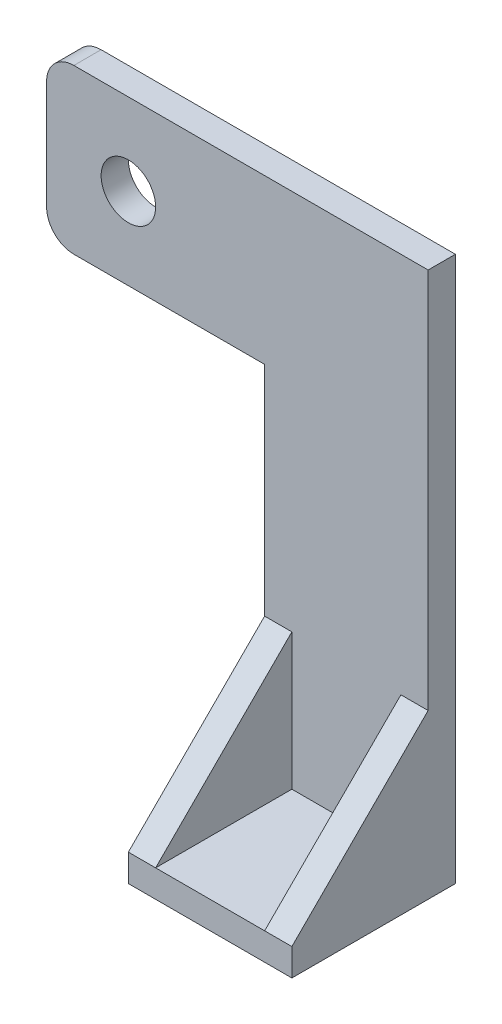
ISO-10303-21;
HEADER;
FILE_DESCRIPTION(('STEP AP214'),'2;1');
FILE_NAME('part.step','',(''),(''),'','','');
FILE_SCHEMA(('AUTOMOTIVE_DESIGN { 1 0 10303 214 1 1 1 1 }'));
ENDSEC;
DATA;
#1=APPLICATION_CONTEXT('core data for automotive mechanical design processes');
#2=APPLICATION_PROTOCOL_DEFINITION('international standard','automotive_design',2000,#1);
#3=PRODUCT_CONTEXT('',#1,'mechanical');
#4=PRODUCT('Part','Part','',(#3));
#5=PRODUCT_RELATED_PRODUCT_CATEGORY('part','',(#4));
#6=PRODUCT_DEFINITION_FORMATION('','',#4);
#7=PRODUCT_DEFINITION_CONTEXT('part definition',#1,'design');
#8=PRODUCT_DEFINITION('design','',#6,#7);
#9=PRODUCT_DEFINITION_SHAPE('','',#8);
#10=(LENGTH_UNIT() NAMED_UNIT(*) SI_UNIT(.MILLI.,.METRE.));
#11=(NAMED_UNIT(*) PLANE_ANGLE_UNIT() SI_UNIT($,.RADIAN.));
#12=(NAMED_UNIT(*) SI_UNIT($,.STERADIAN.) SOLID_ANGLE_UNIT());
#13=UNCERTAINTY_MEASURE_WITH_UNIT(LENGTH_MEASURE(1.E-05),#10,'distance_accuracy_value','');
#14=(GEOMETRIC_REPRESENTATION_CONTEXT(3) GLOBAL_UNCERTAINTY_ASSIGNED_CONTEXT((#13)) GLOBAL_UNIT_ASSIGNED_CONTEXT((#10,
#11,#12)) REPRESENTATION_CONTEXT('',''));
#15=CARTESIAN_POINT('',(0.,0.,0.));
#16=DIRECTION('',(0.,0.,1.));
#17=DIRECTION('',(1.,0.,0.));
#18=AXIS2_PLACEMENT_3D('',#15,#16,#17);
#19=CARTESIAN_POINT('',(0.,-95.,0.));
#20=DIRECTION('',(0.,1.,0.));
#21=DIRECTION('',(0.,0.,1.));
#22=AXIS2_PLACEMENT_3D('',#19,#20,#21);
#23=PLANE('',#22);
#24=DIRECTION('',(-1.,0.,0.));
#25=VECTOR('',#24,1.);
#26=CARTESIAN_POINT('',(40.,-95.,30.));
#27=LINE('',#26,#25);
#28=CARTESIAN_POINT('',(65.,-95.,30.));
#29=VERTEX_POINT('',#28);
#30=CARTESIAN_POINT('',(45.,-95.,30.));
#31=VERTEX_POINT('',#30);
#32=EDGE_CURVE('E238',#29,#31,#27,.T.);
#33=ORIENTED_EDGE('',*,*,#32,.F.);
#34=DIRECTION('',(0.,0.,1.));
#35=VECTOR('',#34,1.);
#36=CARTESIAN_POINT('',(65.,-95.,30.));
#37=LINE('',#36,#35);
#38=CARTESIAN_POINT('',(65.,-95.,5.));
#39=VERTEX_POINT('',#38);
#40=EDGE_CURVE('E251',#39,#29,#37,.T.);
#41=ORIENTED_EDGE('',*,*,#40,.F.);
#42=DIRECTION('',(-1.,0.,0.));
#43=VECTOR('',#42,1.);
#44=CARTESIAN_POINT('',(70.,-95.,5.));
#45=LINE('',#44,#43);
#46=CARTESIAN_POINT('',(45.,-95.,5.));
#47=VERTEX_POINT('',#46);
#48=EDGE_CURVE('E135',#39,#47,#45,.T.);
#49=ORIENTED_EDGE('',*,*,#48,.T.);
#50=DIRECTION('',(0.,0.,1.));
#51=VECTOR('',#50,1.);
#52=CARTESIAN_POINT('',(45.,-95.,30.));
#53=LINE('',#52,#51);
#54=EDGE_CURVE('E244',#47,#31,#53,.T.);
#55=ORIENTED_EDGE('',*,*,#54,.T.);
#56=EDGE_LOOP('',(#33,#41,#49,#55));
#57=FACE_BOUND('',#56,.T.);
#58=ADVANCED_FACE('F36',(#57),#23,.T.);
#59=CARTESIAN_POINT('',(5.,-5.,5.));
#60=DIRECTION('',(0.,0.,1.));
#61=DIRECTION('',(1.,0.,0.));
#62=AXIS2_PLACEMENT_3D('',#59,#60,#61);
#63=PLANE('',#62);
#64=CARTESIAN_POINT('',(15.,-15.,5.));
#65=DIRECTION('',(0.,0.,1.));
#66=DIRECTION('',(1.,0.,0.));
#67=AXIS2_PLACEMENT_3D('',#64,#65,#66);
#68=CIRCLE('',#67,5.);
#69=CARTESIAN_POINT('',(20.,-15.,5.));
#70=VERTEX_POINT('',#69);
#71=EDGE_CURVE('E214',#70,#70,#68,.T.);
#72=ORIENTED_EDGE('',*,*,#71,.F.);
#73=EDGE_LOOP('',(#72));
#74=FACE_BOUND('',#73,.T.);
#75=DIRECTION('',(0.,-1.,0.));
#76=VECTOR('',#75,1.);
#77=CARTESIAN_POINT('',(65.,-95.,5.));
#78=LINE('',#77,#76);
#79=CARTESIAN_POINT('',(65.,-70.,5.));
#80=VERTEX_POINT('',#79);
#81=EDGE_CURVE('E255',#80,#39,#78,.T.);
#82=ORIENTED_EDGE('',*,*,#81,.F.);
#83=DIRECTION('',(1.,0.,0.));
#84=VECTOR('',#83,1.);
#85=CARTESIAN_POINT('',(65.,-70.,5.));
#86=LINE('',#85,#84);
#87=CARTESIAN_POINT('',(70.,-70.,5.));
#88=VERTEX_POINT('',#87);
#89=EDGE_CURVE('E241',#80,#88,#86,.T.);
#90=ORIENTED_EDGE('',*,*,#89,.T.);
#91=DIRECTION('',(0.,-1.,0.));
#92=VECTOR('',#91,1.);
#93=CARTESIAN_POINT('',(70.,-30.,5.));
#94=LINE('',#93,#92);
#95=CARTESIAN_POINT('',(70.,0.,5.));
#96=VERTEX_POINT('',#95);
#97=EDGE_CURVE('E138',#96,#88,#94,.T.);
#98=ORIENTED_EDGE('',*,*,#97,.F.);
#99=DIRECTION('',(1.,0.,0.));
#100=VECTOR('',#99,1.);
#101=CARTESIAN_POINT('',(5.,0.,5.));
#102=LINE('',#101,#100);
#103=CARTESIAN_POINT('',(5.,0.,5.));
#104=VERTEX_POINT('',#103);
#105=EDGE_CURVE('E144',#104,#96,#102,.T.);
#106=ORIENTED_EDGE('',*,*,#105,.F.);
#107=CARTESIAN_POINT('',(5.,-5.,5.));
#108=DIRECTION('',(0.,0.,1.));
#109=DIRECTION('',(1.,0.,0.));
#110=AXIS2_PLACEMENT_3D('',#107,#108,#109);
#111=CIRCLE('',#110,5.);
#112=CARTESIAN_POINT('',(0.,-5.,5.));
#113=VERTEX_POINT('',#112);
#114=EDGE_CURVE('E163',#104,#113,#111,.T.);
#115=ORIENTED_EDGE('',*,*,#114,.T.);
#116=DIRECTION('',(0.,-1.,0.));
#117=VECTOR('',#116,1.);
#118=CARTESIAN_POINT('',(0.,-5.,5.));
#119=LINE('',#118,#117);
#120=CARTESIAN_POINT('',(0.,-25.,5.));
#121=VERTEX_POINT('',#120);
#122=EDGE_CURVE('E94',#113,#121,#119,.T.);
#123=ORIENTED_EDGE('',*,*,#122,.T.);
#124=CARTESIAN_POINT('',(5.,-25.,5.));
#125=DIRECTION('',(0.,0.,-1.));
#126=DIRECTION('',(-1.,0.,0.));
#127=AXIS2_PLACEMENT_3D('',#124,#125,#126);
#128=CIRCLE('',#127,5.);
#129=CARTESIAN_POINT('',(5.,-30.,5.));
#130=VERTEX_POINT('',#129);
#131=EDGE_CURVE('E116',#130,#121,#128,.T.);
#132=ORIENTED_EDGE('',*,*,#131,.F.);
#133=DIRECTION('',(1.,0.,0.));
#134=VECTOR('',#133,1.);
#135=CARTESIAN_POINT('',(5.,-30.,5.));
#136=LINE('',#135,#134);
#137=CARTESIAN_POINT('',(40.,-30.,5.));
#138=VERTEX_POINT('',#137);
#139=EDGE_CURVE('E107',#130,#138,#136,.T.);
#140=ORIENTED_EDGE('',*,*,#139,.T.);
#141=DIRECTION('',(0.,-1.,0.));
#142=VECTOR('',#141,1.);
#143=CARTESIAN_POINT('',(40.,-30.,5.));
#144=LINE('',#143,#142);
#145=CARTESIAN_POINT('',(40.,-70.,5.));
#146=VERTEX_POINT('',#145);
#147=EDGE_CURVE('E114',#138,#146,#144,.T.);
#148=ORIENTED_EDGE('',*,*,#147,.T.);
#149=DIRECTION('',(-1.,0.,0.));
#150=VECTOR('',#149,1.);
#151=CARTESIAN_POINT('',(45.,-70.,5.));
#152=LINE('',#151,#150);
#153=CARTESIAN_POINT('',(45.,-70.,5.));
#154=VERTEX_POINT('',#153);
#155=EDGE_CURVE('E234',#154,#146,#152,.T.);
#156=ORIENTED_EDGE('',*,*,#155,.F.);
#157=DIRECTION('',(0.,-1.,0.));
#158=VECTOR('',#157,1.);
#159=CARTESIAN_POINT('',(45.,-95.,5.));
#160=LINE('',#159,#158);
#161=EDGE_CURVE('E240',#154,#47,#160,.T.);
#162=ORIENTED_EDGE('',*,*,#161,.T.);
#163=ORIENTED_EDGE('',*,*,#48,.F.);
#164=EDGE_LOOP('',(#82,#90,#98,#106,#115,#123,#132,#140,#148,#156,#162,#163));
#165=FACE_BOUND('',#164,.T.);
#166=ADVANCED_FACE('F110',(#74,#165),#63,.T.);
#167=CARTESIAN_POINT('',(5.,-5.,5.));
#168=DIRECTION('',(0.,0.,-1.));
#169=DIRECTION('',(-1.,0.,0.));
#170=AXIS2_PLACEMENT_3D('',#167,#168,#169);
#171=CYLINDRICAL_SURFACE('',#170,5.);
#172=CARTESIAN_POINT('',(5.,-5.,0.));
#173=DIRECTION('',(0.,0.,1.));
#174=DIRECTION('',(1.,0.,0.));
#175=AXIS2_PLACEMENT_3D('',#172,#173,#174);
#176=CIRCLE('',#175,5.);
#177=CARTESIAN_POINT('',(5.,0.,0.));
#178=VERTEX_POINT('',#177);
#179=CARTESIAN_POINT('',(0.,-5.,0.));
#180=VERTEX_POINT('',#179);
#181=EDGE_CURVE('E146',#178,#180,#176,.T.);
#182=ORIENTED_EDGE('',*,*,#181,.T.);
#183=DIRECTION('',(0.,0.,-1.));
#184=VECTOR('',#183,1.);
#185=CARTESIAN_POINT('',(0.,-5.,5.));
#186=LINE('',#185,#184);
#187=EDGE_CURVE('E11',#113,#180,#186,.T.);
#188=ORIENTED_EDGE('',*,*,#187,.F.);
#189=ORIENTED_EDGE('',*,*,#114,.F.);
#190=DIRECTION('',(0.,0.,-1.));
#191=VECTOR('',#190,1.);
#192=CARTESIAN_POINT('',(5.,0.,5.));
#193=LINE('',#192,#191);
#194=EDGE_CURVE('E61',#104,#178,#193,.T.);
#195=ORIENTED_EDGE('',*,*,#194,.T.);
#196=EDGE_LOOP('',(#182,#188,#189,#195));
#197=FACE_BOUND('',#196,.T.);
#198=ADVANCED_FACE('F38',(#197),#171,.T.);
#199=CARTESIAN_POINT('',(0.,-5.,5.));
#200=DIRECTION('',(1.,0.,0.));
#201=DIRECTION('',(0.,0.,-1.));
#202=AXIS2_PLACEMENT_3D('',#199,#200,#201);
#203=PLANE('',#202);
#204=DIRECTION('',(0.,-1.,0.));
#205=VECTOR('',#204,1.);
#206=CARTESIAN_POINT('',(0.,-5.,0.));
#207=LINE('',#206,#205);
#208=CARTESIAN_POINT('',(0.,-25.,0.));
#209=VERTEX_POINT('',#208);
#210=EDGE_CURVE('E148',#180,#209,#207,.T.);
#211=ORIENTED_EDGE('',*,*,#210,.T.);
#212=DIRECTION('',(0.,0.,-1.));
#213=VECTOR('',#212,1.);
#214=CARTESIAN_POINT('',(0.,-25.,5.));
#215=LINE('',#214,#213);
#216=EDGE_CURVE('E45',#121,#209,#215,.T.);
#217=ORIENTED_EDGE('',*,*,#216,.F.);
#218=ORIENTED_EDGE('',*,*,#122,.F.);
#219=ORIENTED_EDGE('',*,*,#187,.T.);
#220=EDGE_LOOP('',(#211,#217,#218,#219));
#221=FACE_BOUND('',#220,.T.);
#222=ADVANCED_FACE('F170',(#221),#203,.F.);
#223=CARTESIAN_POINT('',(5.,-25.,5.));
#224=DIRECTION('',(0.,0.,-1.));
#225=DIRECTION('',(-1.,0.,0.));
#226=AXIS2_PLACEMENT_3D('',#223,#224,#225);
#227=CYLINDRICAL_SURFACE('',#226,5.);
#228=CARTESIAN_POINT('',(5.,-25.,0.));
#229=DIRECTION('',(0.,0.,-1.));
#230=DIRECTION('',(-1.,0.,0.));
#231=AXIS2_PLACEMENT_3D('',#228,#229,#230);
#232=CIRCLE('',#231,5.);
#233=CARTESIAN_POINT('',(5.,-30.,0.));
#234=VERTEX_POINT('',#233);
#235=EDGE_CURVE('E151',#234,#209,#232,.T.);
#236=ORIENTED_EDGE('',*,*,#235,.F.);
#237=DIRECTION('',(0.,0.,-1.));
#238=VECTOR('',#237,1.);
#239=CARTESIAN_POINT('',(5.,-30.,5.));
#240=LINE('',#239,#238);
#241=EDGE_CURVE('E127',#130,#234,#240,.T.);
#242=ORIENTED_EDGE('',*,*,#241,.F.);
#243=ORIENTED_EDGE('',*,*,#131,.T.);
#244=ORIENTED_EDGE('',*,*,#216,.T.);
#245=EDGE_LOOP('',(#236,#242,#243,#244));
#246=FACE_BOUND('',#245,.T.);
#247=ADVANCED_FACE('F169',(#246),#227,.T.);
#248=CARTESIAN_POINT('',(5.,-30.,5.));
#249=DIRECTION('',(0.,1.,0.));
#250=DIRECTION('',(0.,0.,1.));
#251=AXIS2_PLACEMENT_3D('',#248,#249,#250);
#252=PLANE('',#251);
#253=DIRECTION('',(1.,0.,0.));
#254=VECTOR('',#253,1.);
#255=CARTESIAN_POINT('',(5.,-30.,0.));
#256=LINE('',#255,#254);
#257=CARTESIAN_POINT('',(40.,-30.,0.));
#258=VERTEX_POINT('',#257);
#259=EDGE_CURVE('E123',#234,#258,#256,.T.);
#260=ORIENTED_EDGE('',*,*,#259,.T.);
#261=DIRECTION('',(0.,0.,-1.));
#262=VECTOR('',#261,1.);
#263=CARTESIAN_POINT('',(40.,-30.,5.));
#264=LINE('',#263,#262);
#265=EDGE_CURVE('E120',#138,#258,#264,.T.);
#266=ORIENTED_EDGE('',*,*,#265,.F.);
#267=ORIENTED_EDGE('',*,*,#139,.F.);
#268=ORIENTED_EDGE('',*,*,#241,.T.);
#269=EDGE_LOOP('',(#260,#266,#267,#268));
#270=FACE_BOUND('',#269,.T.);
#271=ADVANCED_FACE('F121',(#270),#252,.F.);
#272=CARTESIAN_POINT('',(40.,-30.,5.));
#273=DIRECTION('',(1.,0.,0.));
#274=DIRECTION('',(0.,1.,0.));
#275=AXIS2_PLACEMENT_3D('',#272,#273,#274);
#276=PLANE('',#275);
#277=DIRECTION('',(0.,-1.,0.));
#278=VECTOR('',#277,1.);
#279=CARTESIAN_POINT('',(40.,-30.,0.));
#280=LINE('',#279,#278);
#281=CARTESIAN_POINT('',(40.,-100.,0.));
#282=VERTEX_POINT('',#281);
#283=EDGE_CURVE('E155',#258,#282,#280,.T.);
#284=ORIENTED_EDGE('',*,*,#283,.T.);
#285=DIRECTION('',(0.,0.,-1.));
#286=VECTOR('',#285,1.);
#287=CARTESIAN_POINT('',(40.,-100.,0.));
#288=LINE('',#287,#286);
#289=CARTESIAN_POINT('',(40.,-100.,30.));
#290=VERTEX_POINT('',#289);
#291=EDGE_CURVE('E180',#290,#282,#288,.T.);
#292=ORIENTED_EDGE('',*,*,#291,.F.);
#293=DIRECTION('',(0.,1.,0.));
#294=VECTOR('',#293,1.);
#295=CARTESIAN_POINT('',(40.,-100.,30.));
#296=LINE('',#295,#294);
#297=CARTESIAN_POINT('',(40.,-95.,30.));
#298=VERTEX_POINT('',#297);
#299=EDGE_CURVE('E203',#290,#298,#296,.T.);
#300=ORIENTED_EDGE('',*,*,#299,.T.);
#301=DIRECTION('',(0.,0.707106781186547,-0.707106781186548));
#302=VECTOR('',#301,1.);
#303=CARTESIAN_POINT('',(40.,-70.,5.));
#304=LINE('',#303,#302);
#305=EDGE_CURVE('E134',#298,#146,#304,.T.);
#306=ORIENTED_EDGE('',*,*,#305,.T.);
#307=ORIENTED_EDGE('',*,*,#147,.F.);
#308=ORIENTED_EDGE('',*,*,#265,.T.);
#309=EDGE_LOOP('',(#284,#292,#300,#306,#307,#308));
#310=FACE_BOUND('',#309,.T.);
#311=ADVANCED_FACE('F131',(#310),#276,.F.);
#312=CARTESIAN_POINT('',(70.,0.,5.));
#313=DIRECTION('',(1.,0.,0.));
#314=DIRECTION('',(0.,0.,-1.));
#315=AXIS2_PLACEMENT_3D('',#312,#313,#314);
#316=PLANE('',#315);
#317=DIRECTION('',(0.,0.707106781186547,-0.707106781186548));
#318=VECTOR('',#317,1.);
#319=CARTESIAN_POINT('',(70.,-70.,5.));
#320=LINE('',#319,#318);
#321=CARTESIAN_POINT('',(70.,-95.,30.));
#322=VERTEX_POINT('',#321);
#323=EDGE_CURVE('E252',#322,#88,#320,.T.);
#324=ORIENTED_EDGE('',*,*,#323,.F.);
#325=DIRECTION('',(0.,1.,0.));
#326=VECTOR('',#325,1.);
#327=CARTESIAN_POINT('',(70.,-100.,30.));
#328=LINE('',#327,#326);
#329=CARTESIAN_POINT('',(70.,-100.,30.));
#330=VERTEX_POINT('',#329);
#331=EDGE_CURVE('E212',#330,#322,#328,.T.);
#332=ORIENTED_EDGE('',*,*,#331,.F.);
#333=DIRECTION('',(0.,0.,1.));
#334=VECTOR('',#333,1.);
#335=CARTESIAN_POINT('',(70.,-100.,0.));
#336=LINE('',#335,#334);
#337=CARTESIAN_POINT('',(70.,-100.,0.));
#338=VERTEX_POINT('',#337);
#339=EDGE_CURVE('E195',#338,#330,#336,.T.);
#340=ORIENTED_EDGE('',*,*,#339,.F.);
#341=DIRECTION('',(0.,-1.,0.));
#342=VECTOR('',#341,1.);
#343=CARTESIAN_POINT('',(70.,0.,0.));
#344=LINE('',#343,#342);
#345=CARTESIAN_POINT('',(70.,0.,0.));
#346=VERTEX_POINT('',#345);
#347=EDGE_CURVE('E157',#346,#338,#344,.T.);
#348=ORIENTED_EDGE('',*,*,#347,.F.);
#349=DIRECTION('',(0.,0.,-1.));
#350=VECTOR('',#349,1.);
#351=CARTESIAN_POINT('',(70.,0.,5.));
#352=LINE('',#351,#350);
#353=EDGE_CURVE('E128',#96,#346,#352,.T.);
#354=ORIENTED_EDGE('',*,*,#353,.F.);
#355=ORIENTED_EDGE('',*,*,#97,.T.);
#356=EDGE_LOOP('',(#324,#332,#340,#348,#354,#355));
#357=FACE_BOUND('',#356,.T.);
#358=ADVANCED_FACE('F228',(#357),#316,.T.);
#359=CARTESIAN_POINT('',(5.,0.,5.));
#360=DIRECTION('',(0.,1.,0.));
#361=DIRECTION('',(0.,0.,1.));
#362=AXIS2_PLACEMENT_3D('',#359,#360,#361);
#363=PLANE('',#362);
#364=DIRECTION('',(1.,0.,0.));
#365=VECTOR('',#364,1.);
#366=CARTESIAN_POINT('',(5.,0.,0.));
#367=LINE('',#366,#365);
#368=EDGE_CURVE('E160',#178,#346,#367,.T.);
#369=ORIENTED_EDGE('',*,*,#368,.F.);
#370=ORIENTED_EDGE('',*,*,#194,.F.);
#371=ORIENTED_EDGE('',*,*,#105,.T.);
#372=ORIENTED_EDGE('',*,*,#353,.T.);
#373=EDGE_LOOP('',(#369,#370,#371,#372));
#374=FACE_BOUND('',#373,.T.);
#375=ADVANCED_FACE('F223',(#374),#363,.T.);
#376=CARTESIAN_POINT('',(5.,-5.,0.));
#377=DIRECTION('',(0.,0.,1.));
#378=DIRECTION('',(1.,0.,0.));
#379=AXIS2_PLACEMENT_3D('',#376,#377,#378);
#380=PLANE('',#379);
#381=CARTESIAN_POINT('',(15.,-15.,0.));
#382=DIRECTION('',(0.,0.,1.));
#383=DIRECTION('',(1.,0.,0.));
#384=AXIS2_PLACEMENT_3D('',#381,#382,#383);
#385=CIRCLE('',#384,5.);
#386=CARTESIAN_POINT('',(20.,-15.,0.));
#387=VERTEX_POINT('',#386);
#388=EDGE_CURVE('E40',#387,#387,#385,.T.);
#389=ORIENTED_EDGE('',*,*,#388,.T.);
#390=EDGE_LOOP('',(#389));
#391=FACE_BOUND('',#390,.T.);
#392=ORIENTED_EDGE('',*,*,#181,.F.);
#393=ORIENTED_EDGE('',*,*,#368,.T.);
#394=ORIENTED_EDGE('',*,*,#347,.T.);
#395=DIRECTION('',(1.,0.,0.));
#396=VECTOR('',#395,1.);
#397=CARTESIAN_POINT('',(40.,-100.,0.));
#398=LINE('',#397,#396);
#399=EDGE_CURVE('E177',#282,#338,#398,.T.);
#400=ORIENTED_EDGE('',*,*,#399,.F.);
#401=ORIENTED_EDGE('',*,*,#283,.F.);
#402=ORIENTED_EDGE('',*,*,#259,.F.);
#403=ORIENTED_EDGE('',*,*,#235,.T.);
#404=ORIENTED_EDGE('',*,*,#210,.F.);
#405=EDGE_LOOP('',(#392,#393,#394,#400,#401,#402,#403,#404));
#406=FACE_BOUND('',#405,.T.);
#407=ADVANCED_FACE('F173',(#391,#406),#380,.F.);
#408=CARTESIAN_POINT('',(15.,-15.,-5.));
#409=DIRECTION('',(0.,0.,1.));
#410=DIRECTION('',(1.,0.,0.));
#411=AXIS2_PLACEMENT_3D('',#408,#409,#410);
#412=CYLINDRICAL_SURFACE('',#411,5.);
#413=ORIENTED_EDGE('',*,*,#71,.T.);
#414=EDGE_LOOP('',(#413));
#415=FACE_BOUND('',#414,.T.);
#416=ORIENTED_EDGE('',*,*,#388,.F.);
#417=EDGE_LOOP('',(#416));
#418=FACE_BOUND('',#417,.T.);
#419=ADVANCED_FACE('F303',(#415,#418),#412,.F.);
#420=CARTESIAN_POINT('',(40.,-100.,30.));
#421=DIRECTION('',(0.,0.,-1.));
#422=DIRECTION('',(-1.,0.,0.));
#423=AXIS2_PLACEMENT_3D('',#420,#421,#422);
#424=PLANE('',#423);
#425=EDGE_CURVE('E217',#322,#29,#27,.T.);
#426=ORIENTED_EDGE('',*,*,#425,.T.);
#427=ORIENTED_EDGE('',*,*,#32,.T.);
#428=DIRECTION('',(-1.,0.,0.));
#429=VECTOR('',#428,1.);
#430=CARTESIAN_POINT('',(45.,-95.,30.));
#431=LINE('',#430,#429);
#432=EDGE_CURVE('E211',#31,#298,#431,.T.);
#433=ORIENTED_EDGE('',*,*,#432,.T.);
#434=ORIENTED_EDGE('',*,*,#299,.F.);
#435=DIRECTION('',(-1.,0.,0.));
#436=VECTOR('',#435,1.);
#437=CARTESIAN_POINT('',(40.,-100.,30.));
#438=LINE('',#437,#436);
#439=EDGE_CURVE('E198',#330,#290,#438,.T.);
#440=ORIENTED_EDGE('',*,*,#439,.F.);
#441=ORIENTED_EDGE('',*,*,#331,.T.);
#442=EDGE_LOOP('',(#426,#427,#433,#434,#440,#441));
#443=FACE_BOUND('',#442,.T.);
#444=ADVANCED_FACE('F207',(#443),#424,.F.);
#445=CARTESIAN_POINT('',(0.,-100.,0.));
#446=DIRECTION('',(0.,1.,0.));
#447=DIRECTION('',(0.,0.,1.));
#448=AXIS2_PLACEMENT_3D('',#445,#446,#447);
#449=PLANE('',#448);
#450=ORIENTED_EDGE('',*,*,#291,.T.);
#451=ORIENTED_EDGE('',*,*,#399,.T.);
#452=ORIENTED_EDGE('',*,*,#339,.T.);
#453=ORIENTED_EDGE('',*,*,#439,.T.);
#454=EDGE_LOOP('',(#450,#451,#452,#453));
#455=FACE_BOUND('',#454,.T.);
#456=ADVANCED_FACE('F200',(#455),#449,.F.);
#457=CARTESIAN_POINT('',(45.,-70.,5.));
#458=DIRECTION('',(0.,0.707106781186548,0.707106781186547));
#459=DIRECTION('',(0.,-0.707106781186547,0.707106781186548));
#460=AXIS2_PLACEMENT_3D('',#457,#458,#459);
#461=PLANE('',#460);
#462=ORIENTED_EDGE('',*,*,#305,.F.);
#463=ORIENTED_EDGE('',*,*,#432,.F.);
#464=DIRECTION('',(0.,0.707106781186547,-0.707106781186548));
#465=VECTOR('',#464,1.);
#466=CARTESIAN_POINT('',(45.,-70.,5.));
#467=LINE('',#466,#465);
#468=EDGE_CURVE('E235',#31,#154,#467,.T.);
#469=ORIENTED_EDGE('',*,*,#468,.T.);
#470=ORIENTED_EDGE('',*,*,#155,.T.);
#471=EDGE_LOOP('',(#462,#463,#469,#470));
#472=FACE_BOUND('',#471,.T.);
#473=ADVANCED_FACE('F275',(#472),#461,.T.);
#474=CARTESIAN_POINT('',(45.,0.,0.));
#475=DIRECTION('',(-1.,0.,0.));
#476=DIRECTION('',(0.,0.,1.));
#477=AXIS2_PLACEMENT_3D('',#474,#475,#476);
#478=PLANE('',#477);
#479=ORIENTED_EDGE('',*,*,#161,.F.);
#480=ORIENTED_EDGE('',*,*,#468,.F.);
#481=ORIENTED_EDGE('',*,*,#54,.F.);
#482=EDGE_LOOP('',(#479,#480,#481));
#483=FACE_BOUND('',#482,.T.);
#484=ADVANCED_FACE('F273',(#483),#478,.F.);
#485=CARTESIAN_POINT('',(65.,-70.,5.));
#486=DIRECTION('',(0.,-0.707106781186548,-0.707106781186547));
#487=DIRECTION('',(0.,0.707106781186547,-0.707106781186548));
#488=AXIS2_PLACEMENT_3D('',#485,#486,#487);
#489=PLANE('',#488);
#490=ORIENTED_EDGE('',*,*,#323,.T.);
#491=ORIENTED_EDGE('',*,*,#89,.F.);
#492=DIRECTION('',(0.,0.707106781186547,-0.707106781186548));
#493=VECTOR('',#492,1.);
#494=CARTESIAN_POINT('',(65.,-70.,5.));
#495=LINE('',#494,#493);
#496=EDGE_CURVE('E52',#29,#80,#495,.T.);
#497=ORIENTED_EDGE('',*,*,#496,.F.);
#498=ORIENTED_EDGE('',*,*,#425,.F.);
#499=EDGE_LOOP('',(#490,#491,#497,#498));
#500=FACE_BOUND('',#499,.T.);
#501=ADVANCED_FACE('F282',(#500),#489,.F.);
#502=CARTESIAN_POINT('',(65.,0.,0.));
#503=DIRECTION('',(1.,0.,0.));
#504=DIRECTION('',(0.,0.,1.));
#505=AXIS2_PLACEMENT_3D('',#502,#503,#504);
#506=PLANE('',#505);
#507=ORIENTED_EDGE('',*,*,#81,.T.);
#508=ORIENTED_EDGE('',*,*,#40,.T.);
#509=ORIENTED_EDGE('',*,*,#496,.T.);
#510=EDGE_LOOP('',(#507,#508,#509));
#511=FACE_BOUND('',#510,.T.);
#512=ADVANCED_FACE('F262',(#511),#506,.F.);
#513=CLOSED_SHELL('',(#58,#166,#198,#222,#247,#271,#311,#358,#375,#407,#419,#444,#456,#473,#484,
#501,#512));
#514=MANIFOLD_SOLID_BREP('B2',#513);
#515=ADVANCED_BREP_SHAPE_REPRESENTATION('',(#18,#514),#14);
#516=SHAPE_DEFINITION_REPRESENTATION(#9,#515);
ENDSEC;
END-ISO-10303-21;
